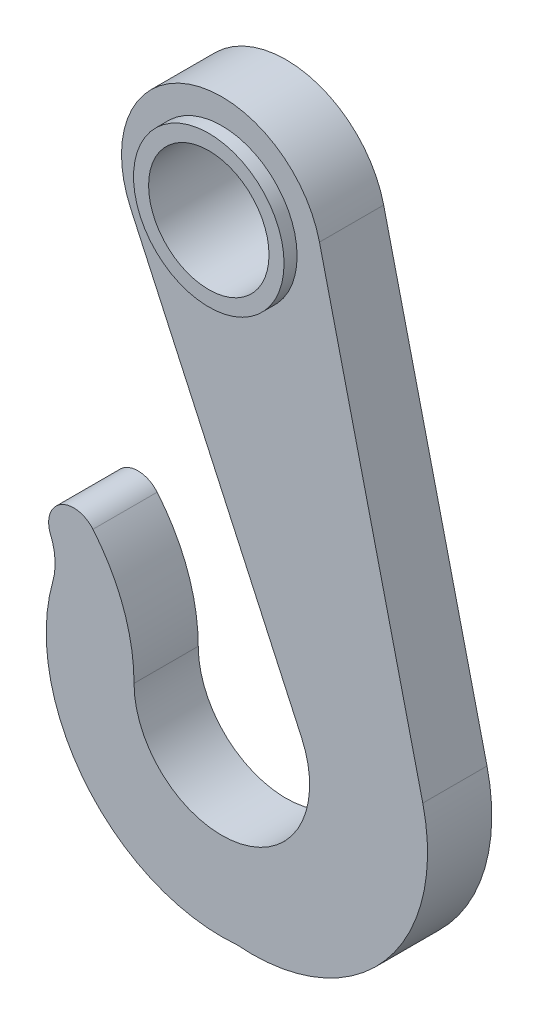
ISO-10303-21;
HEADER;
FILE_DESCRIPTION(('STEP AP214'),'2;1');
FILE_NAME('part.step','',(''),(''),'','','');
FILE_SCHEMA(('AUTOMOTIVE_DESIGN { 1 0 10303 214 1 1 1 1 }'));
ENDSEC;
DATA;
#1=APPLICATION_CONTEXT('core data for automotive mechanical design processes');
#2=APPLICATION_PROTOCOL_DEFINITION('international standard','automotive_design',2000,#1);
#3=PRODUCT_CONTEXT('',#1,'mechanical');
#4=PRODUCT('Part','Part','',(#3));
#5=PRODUCT_RELATED_PRODUCT_CATEGORY('part','',(#4));
#6=PRODUCT_DEFINITION_FORMATION('','',#4);
#7=PRODUCT_DEFINITION_CONTEXT('part definition',#1,'design');
#8=PRODUCT_DEFINITION('design','',#6,#7);
#9=PRODUCT_DEFINITION_SHAPE('','',#8);
#10=(LENGTH_UNIT() NAMED_UNIT(*) SI_UNIT(.MILLI.,.METRE.));
#11=(NAMED_UNIT(*) PLANE_ANGLE_UNIT() SI_UNIT($,.RADIAN.));
#12=(NAMED_UNIT(*) SI_UNIT($,.STERADIAN.) SOLID_ANGLE_UNIT());
#13=UNCERTAINTY_MEASURE_WITH_UNIT(LENGTH_MEASURE(1.E-05),#10,'distance_accuracy_value','');
#14=(GEOMETRIC_REPRESENTATION_CONTEXT(3) GLOBAL_UNCERTAINTY_ASSIGNED_CONTEXT((#13)) GLOBAL_UNIT_ASSIGNED_CONTEXT((#10,
#11,#12)) REPRESENTATION_CONTEXT('',''));
#15=CARTESIAN_POINT('',(0.,0.,0.));
#16=DIRECTION('',(0.,0.,1.));
#17=DIRECTION('',(1.,0.,0.));
#18=AXIS2_PLACEMENT_3D('',#15,#16,#17);
#19=CARTESIAN_POINT('',(0.,0.,0.64));
#20=DIRECTION('',(0.,0.,-1.));
#21=DIRECTION('',(-1.,0.,0.));
#22=AXIS2_PLACEMENT_3D('',#19,#20,#21);
#23=CYLINDRICAL_SURFACE('',#22,1.);
#24=CARTESIAN_POINT('',(0.,0.,0.));
#25=DIRECTION('',(0.,0.,1.));
#26=DIRECTION('',(1.,0.,0.));
#27=AXIS2_PLACEMENT_3D('',#24,#25,#26);
#28=CIRCLE('',#27,1.);
#29=CARTESIAN_POINT('',(0.972829673476124,0.231521978231741,0.));
#30=VERTEX_POINT('',#29);
#31=CARTESIAN_POINT('',(-0.909059342886309,-0.416666666666667,0.));
#32=VERTEX_POINT('',#31);
#33=EDGE_CURVE('E155',#30,#32,#28,.T.);
#34=ORIENTED_EDGE('',*,*,#33,.T.);
#35=DIRECTION('',(0.,0.,-1.));
#36=VECTOR('',#35,1.);
#37=CARTESIAN_POINT('',(-0.909059342886309,-0.416666666666667,0.64));
#38=LINE('',#37,#36);
#39=CARTESIAN_POINT('',(-0.909059342886309,-0.416666666666667,0.64));
#40=VERTEX_POINT('',#39);
#41=EDGE_CURVE('E48',#40,#32,#38,.T.);
#42=ORIENTED_EDGE('',*,*,#41,.F.);
#43=CARTESIAN_POINT('',(0.,0.,0.64));
#44=DIRECTION('',(0.,0.,1.));
#45=DIRECTION('',(1.,0.,0.));
#46=AXIS2_PLACEMENT_3D('',#43,#44,#45);
#47=CIRCLE('',#46,1.);
#48=CARTESIAN_POINT('',(0.972829673476124,0.231521978231741,0.64));
#49=VERTEX_POINT('',#48);
#50=EDGE_CURVE('E187',#49,#40,#47,.T.);
#51=ORIENTED_EDGE('',*,*,#50,.F.);
#52=DIRECTION('',(0.,0.,-1.));
#53=VECTOR('',#52,1.);
#54=CARTESIAN_POINT('',(0.972829673476124,0.231521978231741,0.64));
#55=LINE('',#54,#53);
#56=EDGE_CURVE('E64',#49,#30,#55,.T.);
#57=ORIENTED_EDGE('',*,*,#56,.T.);
#58=EDGE_LOOP('',(#34,#42,#51,#57));
#59=FACE_BOUND('',#58,.T.);
#60=ADVANCED_FACE('F45',(#59),#23,.T.);
#61=CARTESIAN_POINT('',(-0.909059342886309,-0.416666666666667,0.64));
#62=DIRECTION('',(0.90905934288631,0.416666666666667,0.));
#63=DIRECTION('',(-0.416666666666667,0.90905934288631,0.));
#64=AXIS2_PLACEMENT_3D('',#61,#62,#63);
#65=PLANE('',#64);
#66=DIRECTION('',(0.416666666666667,-0.90905934288631,0.));
#67=VECTOR('',#66,1.);
#68=CARTESIAN_POINT('',(-0.909059342886309,-0.416666666666667,0.));
#69=LINE('',#68,#67);
#70=CARTESIAN_POINT('',(0.795426925025521,-4.13541666666667,0.));
#71=VERTEX_POINT('',#70);
#72=EDGE_CURVE('E158',#32,#71,#69,.T.);
#73=ORIENTED_EDGE('',*,*,#72,.T.);
#74=DIRECTION('',(0.,0.,-1.));
#75=VECTOR('',#74,1.);
#76=CARTESIAN_POINT('',(0.795426925025521,-4.13541666666667,0.64));
#77=LINE('',#76,#75);
#78=CARTESIAN_POINT('',(0.795426925025521,-4.13541666666667,0.64));
#79=VERTEX_POINT('',#78);
#80=EDGE_CURVE('E203',#79,#71,#77,.T.);
#81=ORIENTED_EDGE('',*,*,#80,.F.);
#82=DIRECTION('',(0.416666666666667,-0.90905934288631,0.));
#83=VECTOR('',#82,1.);
#84=CARTESIAN_POINT('',(-0.909059342886309,-0.416666666666667,0.64));
#85=LINE('',#84,#83);
#86=EDGE_CURVE('E107',#40,#79,#85,.T.);
#87=ORIENTED_EDGE('',*,*,#86,.F.);
#88=ORIENTED_EDGE('',*,*,#41,.T.);
#89=EDGE_LOOP('',(#73,#81,#87,#88));
#90=FACE_BOUND('',#89,.T.);
#91=ADVANCED_FACE('F250',(#90),#65,.F.);
#92=CARTESIAN_POINT('',(0.,-4.5,0.64));
#93=DIRECTION('',(0.,0.,-1.));
#94=DIRECTION('',(-1.,0.,0.));
#95=AXIS2_PLACEMENT_3D('',#92,#93,#94);
#96=CYLINDRICAL_SURFACE('',#95,0.875);
#97=CARTESIAN_POINT('',(0.,-4.5,0.));
#98=DIRECTION('',(0.,0.,1.));
#99=DIRECTION('',(1.,0.,0.));
#100=AXIS2_PLACEMENT_3D('',#97,#98,#99);
#101=CIRCLE('',#100,0.875);
#102=CARTESIAN_POINT('',(-0.874999999999999,-4.5,0.));
#103=VERTEX_POINT('',#102);
#104=EDGE_CURVE('E163',#103,#71,#101,.T.);
#105=ORIENTED_EDGE('',*,*,#104,.F.);
#106=DIRECTION('',(0.,0.,-1.));
#107=VECTOR('',#106,1.);
#108=CARTESIAN_POINT('',(-0.874999999999999,-4.5,0.64));
#109=LINE('',#108,#107);
#110=CARTESIAN_POINT('',(-0.874999999999999,-4.5,0.64));
#111=VERTEX_POINT('',#110);
#112=EDGE_CURVE('E201',#111,#103,#109,.T.);
#113=ORIENTED_EDGE('',*,*,#112,.F.);
#114=CARTESIAN_POINT('',(0.,-4.5,0.64));
#115=DIRECTION('',(0.,0.,1.));
#116=DIRECTION('',(1.,0.,0.));
#117=AXIS2_PLACEMENT_3D('',#114,#115,#116);
#118=CIRCLE('',#117,0.875);
#119=EDGE_CURVE('E222',#111,#79,#118,.T.);
#120=ORIENTED_EDGE('',*,*,#119,.T.);
#121=ORIENTED_EDGE('',*,*,#80,.T.);
#122=EDGE_LOOP('',(#105,#113,#120,#121));
#123=FACE_BOUND('',#122,.T.);
#124=ADVANCED_FACE('F254',(#123),#96,.F.);
#125=CARTESIAN_POINT('',(-2.625,-4.5,0.64));
#126=DIRECTION('',(0.,0.,-1.));
#127=DIRECTION('',(-1.,0.,0.));
#128=AXIS2_PLACEMENT_3D('',#125,#126,#127);
#129=CYLINDRICAL_SURFACE('',#128,1.75);
#130=CARTESIAN_POINT('',(-2.625,-4.5,0.));
#131=DIRECTION('',(0.,0.,1.));
#132=DIRECTION('',(1.,0.,0.));
#133=AXIS2_PLACEMENT_3D('',#130,#131,#132);
#134=CIRCLE('',#133,1.75);
#135=CARTESIAN_POINT('',(-1.28442222454179,-3.37512168304855,0.));
#136=VERTEX_POINT('',#135);
#137=EDGE_CURVE('E167',#103,#136,#134,.T.);
#138=ORIENTED_EDGE('',*,*,#137,.T.);
#139=DIRECTION('',(0.,0.,-1.));
#140=VECTOR('',#139,1.);
#141=CARTESIAN_POINT('',(-1.28442222454179,-3.37512168304855,0.64));
#142=LINE('',#141,#140);
#143=CARTESIAN_POINT('',(-1.28442222454179,-3.37512168304855,0.64));
#144=VERTEX_POINT('',#143);
#145=EDGE_CURVE('E197',#144,#136,#142,.T.);
#146=ORIENTED_EDGE('',*,*,#145,.F.);
#147=CARTESIAN_POINT('',(-2.625,-4.5,0.64));
#148=DIRECTION('',(0.,0.,1.));
#149=DIRECTION('',(1.,0.,0.));
#150=AXIS2_PLACEMENT_3D('',#147,#148,#149);
#151=CIRCLE('',#150,1.75);
#152=EDGE_CURVE('E225',#111,#144,#151,.T.);
#153=ORIENTED_EDGE('',*,*,#152,.F.);
#154=ORIENTED_EDGE('',*,*,#112,.T.);
#155=EDGE_LOOP('',(#138,#146,#153,#154));
#156=FACE_BOUND('',#155,.T.);
#157=ADVANCED_FACE('F260',(#156),#129,.T.);
#158=CARTESIAN_POINT('',(-1.47593333532153,-3.53581858547019,0.64));
#159=DIRECTION('',(0.,0.,-1.));
#160=DIRECTION('',(-1.,0.,0.));
#161=AXIS2_PLACEMENT_3D('',#158,#159,#160);
#162=CYLINDRICAL_SURFACE('',#161,0.25);
#163=CARTESIAN_POINT('',(-1.47593333532153,-3.53581858547019,0.));
#164=DIRECTION('',(0.,0.,1.));
#165=DIRECTION('',(1.,0.,0.));
#166=AXIS2_PLACEMENT_3D('',#163,#164,#165);
#167=CIRCLE('',#166,0.25);
#168=CARTESIAN_POINT('',(-1.70694730682401,-3.63138293536413,0.));
#169=VERTEX_POINT('',#168);
#170=EDGE_CURVE('E170',#136,#169,#167,.T.);
#171=ORIENTED_EDGE('',*,*,#170,.T.);
#172=DIRECTION('',(0.,0.,-1.));
#173=VECTOR('',#172,1.);
#174=CARTESIAN_POINT('',(-1.70694730682401,-3.63138293536413,0.64));
#175=LINE('',#174,#173);
#176=CARTESIAN_POINT('',(-1.70694730682401,-3.63138293536413,0.64));
#177=VERTEX_POINT('',#176);
#178=EDGE_CURVE('E194',#177,#169,#175,.T.);
#179=ORIENTED_EDGE('',*,*,#178,.F.);
#180=CARTESIAN_POINT('',(-1.47593333532153,-3.53581858547019,0.64));
#181=DIRECTION('',(0.,0.,1.));
#182=DIRECTION('',(1.,0.,0.));
#183=AXIS2_PLACEMENT_3D('',#180,#181,#182);
#184=CIRCLE('',#183,0.25);
#185=EDGE_CURVE('E228',#144,#177,#184,.T.);
#186=ORIENTED_EDGE('',*,*,#185,.F.);
#187=ORIENTED_EDGE('',*,*,#145,.T.);
#188=EDGE_LOOP('',(#171,#179,#186,#187));
#189=FACE_BOUND('',#188,.T.);
#190=ADVANCED_FACE('F263',(#189),#162,.T.);
#191=CARTESIAN_POINT('',(-2.26138083842997,-3.86073737510958,0.64));
#192=DIRECTION('',(0.,0.,-1.));
#193=DIRECTION('',(-1.,0.,0.));
#194=AXIS2_PLACEMENT_3D('',#191,#192,#193);
#195=CYLINDRICAL_SURFACE('',#194,0.6);
#196=CARTESIAN_POINT('',(-2.26138083842997,-3.86073737510958,0.));
#197=DIRECTION('',(0.,0.,1.));
#198=DIRECTION('',(1.,0.,0.));
#199=AXIS2_PLACEMENT_3D('',#196,#197,#198);
#200=CIRCLE('',#199,0.6);
#201=CARTESIAN_POINT('',(-1.68400700734146,-4.02395336444331,0.));
#202=VERTEX_POINT('',#201);
#203=EDGE_CURVE('E174',#202,#169,#200,.T.);
#204=ORIENTED_EDGE('',*,*,#203,.F.);
#205=DIRECTION('',(0.,0.,-1.));
#206=VECTOR('',#205,1.);
#207=CARTESIAN_POINT('',(-1.68400700734146,-4.02395336444331,0.64));
#208=LINE('',#207,#206);
#209=CARTESIAN_POINT('',(-1.68400700734146,-4.02395336444331,0.64));
#210=VERTEX_POINT('',#209);
#211=EDGE_CURVE('E145',#210,#202,#208,.T.);
#212=ORIENTED_EDGE('',*,*,#211,.F.);
#213=CARTESIAN_POINT('',(-2.26138083842997,-3.86073737510958,0.64));
#214=DIRECTION('',(0.,0.,1.));
#215=DIRECTION('',(1.,0.,0.));
#216=AXIS2_PLACEMENT_3D('',#213,#214,#215);
#217=CIRCLE('',#216,0.6);
#218=EDGE_CURVE('E133',#210,#177,#217,.T.);
#219=ORIENTED_EDGE('',*,*,#218,.T.);
#220=ORIENTED_EDGE('',*,*,#178,.T.);
#221=EDGE_LOOP('',(#204,#212,#219,#220));
#222=FACE_BOUND('',#221,.T.);
#223=ADVANCED_FACE('F233',(#222),#195,.F.);
#224=CARTESIAN_POINT('',(0.,-4.5,0.64));
#225=DIRECTION('',(0.,0.,-1.));
#226=DIRECTION('',(-1.,0.,0.));
#227=AXIS2_PLACEMENT_3D('',#224,#225,#226);
#228=CYLINDRICAL_SURFACE('',#227,1.75);
#229=CARTESIAN_POINT('',(0.,-4.5,0.));
#230=DIRECTION('',(0.,0.,1.));
#231=DIRECTION('',(1.,0.,0.));
#232=AXIS2_PLACEMENT_3D('',#229,#230,#231);
#233=CIRCLE('',#232,1.75);
#234=CARTESIAN_POINT('',(0.150000000000004,-6.24355957741627,0.));
#235=VERTEX_POINT('',#234);
#236=EDGE_CURVE('E141',#202,#235,#233,.T.);
#237=ORIENTED_EDGE('',*,*,#236,.T.);
#238=DIRECTION('',(0.,0.,-1.));
#239=VECTOR('',#238,1.);
#240=CARTESIAN_POINT('',(0.150000000000004,-6.24355957741627,0.64));
#241=LINE('',#240,#239);
#242=CARTESIAN_POINT('',(0.150000000000004,-6.24355957741627,0.64));
#243=VERTEX_POINT('',#242);
#244=EDGE_CURVE('E138',#243,#235,#241,.T.);
#245=ORIENTED_EDGE('',*,*,#244,.F.);
#246=CARTESIAN_POINT('',(0.,-4.5,0.64));
#247=DIRECTION('',(0.,0.,1.));
#248=DIRECTION('',(1.,0.,0.));
#249=AXIS2_PLACEMENT_3D('',#246,#247,#248);
#250=CIRCLE('',#249,1.75);
#251=EDGE_CURVE('E126',#210,#243,#250,.T.);
#252=ORIENTED_EDGE('',*,*,#251,.F.);
#253=ORIENTED_EDGE('',*,*,#211,.T.);
#254=EDGE_LOOP('',(#237,#245,#252,#253));
#255=FACE_BOUND('',#254,.T.);
#256=ADVANCED_FACE('F139',(#255),#228,.T.);
#257=CARTESIAN_POINT('',(0.3,-4.5,0.64));
#258=DIRECTION('',(0.,0.,-1.));
#259=DIRECTION('',(-1.,0.,0.));
#260=AXIS2_PLACEMENT_3D('',#257,#258,#259);
#261=CYLINDRICAL_SURFACE('',#260,1.75);
#262=CARTESIAN_POINT('',(0.3,-4.5,0.));
#263=DIRECTION('',(0.,0.,1.));
#264=DIRECTION('',(1.,0.,0.));
#265=AXIS2_PLACEMENT_3D('',#262,#263,#264);
#266=CIRCLE('',#265,1.75);
#267=CARTESIAN_POINT('',(2.00245192858322,-4.09483653809445,0.));
#268=VERTEX_POINT('',#267);
#269=EDGE_CURVE('E180',#235,#268,#266,.T.);
#270=ORIENTED_EDGE('',*,*,#269,.T.);
#271=DIRECTION('',(0.,0.,-1.));
#272=VECTOR('',#271,1.);
#273=CARTESIAN_POINT('',(2.00245192858322,-4.09483653809445,0.64));
#274=LINE('',#273,#272);
#275=CARTESIAN_POINT('',(2.00245192858322,-4.09483653809445,0.64));
#276=VERTEX_POINT('',#275);
#277=EDGE_CURVE('E94',#276,#268,#274,.T.);
#278=ORIENTED_EDGE('',*,*,#277,.F.);
#279=CARTESIAN_POINT('',(0.3,-4.5,0.64));
#280=DIRECTION('',(0.,0.,1.));
#281=DIRECTION('',(1.,0.,0.));
#282=AXIS2_PLACEMENT_3D('',#279,#280,#281);
#283=CIRCLE('',#282,1.75);
#284=EDGE_CURVE('E131',#243,#276,#283,.T.);
#285=ORIENTED_EDGE('',*,*,#284,.F.);
#286=ORIENTED_EDGE('',*,*,#244,.T.);
#287=EDGE_LOOP('',(#270,#278,#285,#286));
#288=FACE_BOUND('',#287,.T.);
#289=ADVANCED_FACE('F147',(#288),#261,.T.);
#290=CARTESIAN_POINT('',(0.972829673476124,0.231521978231741,0.64));
#291=DIRECTION('',(0.972829673476123,0.231521978231742,0.));
#292=DIRECTION('',(-0.231521978231742,0.972829673476123,0.));
#293=AXIS2_PLACEMENT_3D('',#290,#291,#292);
#294=PLANE('',#293);
#295=DIRECTION('',(0.231521978231742,-0.972829673476123,0.));
#296=VECTOR('',#295,1.);
#297=CARTESIAN_POINT('',(0.972829673476124,0.231521978231741,0.));
#298=LINE('',#297,#296);
#299=EDGE_CURVE('E183',#30,#268,#298,.T.);
#300=ORIENTED_EDGE('',*,*,#299,.F.);
#301=ORIENTED_EDGE('',*,*,#56,.F.);
#302=DIRECTION('',(0.231521978231742,-0.972829673476123,0.));
#303=VECTOR('',#302,1.);
#304=CARTESIAN_POINT('',(0.972829673476124,0.231521978231741,0.64));
#305=LINE('',#304,#303);
#306=EDGE_CURVE('E149',#49,#276,#305,.T.);
#307=ORIENTED_EDGE('',*,*,#306,.T.);
#308=ORIENTED_EDGE('',*,*,#277,.T.);
#309=EDGE_LOOP('',(#300,#301,#307,#308));
#310=FACE_BOUND('',#309,.T.);
#311=ADVANCED_FACE('F238',(#310),#294,.T.);
#312=CARTESIAN_POINT('',(0.,0.,0.64));
#313=DIRECTION('',(0.,0.,1.));
#314=DIRECTION('',(1.,0.,0.));
#315=AXIS2_PLACEMENT_3D('',#312,#313,#314);
#316=PLANE('',#315);
#317=CARTESIAN_POINT('',(0.,0.,0.64));
#318=DIRECTION('',(0.,0.,1.));
#319=DIRECTION('',(1.,0.,0.));
#320=AXIS2_PLACEMENT_3D('',#317,#318,#319);
#321=CIRCLE('',#320,0.75);
#322=CARTESIAN_POINT('',(0.75,0.,0.64));
#323=VERTEX_POINT('',#322);
#324=EDGE_CURVE('E55',#323,#323,#321,.T.);
#325=ORIENTED_EDGE('',*,*,#324,.F.);
#326=EDGE_LOOP('',(#325));
#327=FACE_BOUND('',#326,.T.);
#328=ORIENTED_EDGE('',*,*,#50,.T.);
#329=ORIENTED_EDGE('',*,*,#86,.T.);
#330=ORIENTED_EDGE('',*,*,#119,.F.);
#331=ORIENTED_EDGE('',*,*,#152,.T.);
#332=ORIENTED_EDGE('',*,*,#185,.T.);
#333=ORIENTED_EDGE('',*,*,#218,.F.);
#334=ORIENTED_EDGE('',*,*,#251,.T.);
#335=ORIENTED_EDGE('',*,*,#284,.T.);
#336=ORIENTED_EDGE('',*,*,#306,.F.);
#337=EDGE_LOOP('',(#328,#329,#330,#331,#332,#333,#334,#335,#336));
#338=FACE_BOUND('',#337,.T.);
#339=ADVANCED_FACE('F128',(#327,#338),#316,.T.);
#340=CARTESIAN_POINT('',(0.,0.,0.));
#341=DIRECTION('',(0.,0.,1.));
#342=DIRECTION('',(1.,0.,0.));
#343=AXIS2_PLACEMENT_3D('',#340,#341,#342);
#344=PLANE('',#343);
#345=CARTESIAN_POINT('',(0.,0.,0.));
#346=DIRECTION('',(0.,0.,-1.));
#347=DIRECTION('',(-1.,0.,0.));
#348=AXIS2_PLACEMENT_3D('',#345,#346,#347);
#349=CIRCLE('',#348,0.75);
#350=CARTESIAN_POINT('',(-0.75,0.,0.));
#351=VERTEX_POINT('',#350);
#352=EDGE_CURVE('E11',#351,#351,#349,.T.);
#353=ORIENTED_EDGE('',*,*,#352,.F.);
#354=EDGE_LOOP('',(#353));
#355=FACE_BOUND('',#354,.T.);
#356=ORIENTED_EDGE('',*,*,#33,.F.);
#357=ORIENTED_EDGE('',*,*,#299,.T.);
#358=ORIENTED_EDGE('',*,*,#269,.F.);
#359=ORIENTED_EDGE('',*,*,#236,.F.);
#360=ORIENTED_EDGE('',*,*,#203,.T.);
#361=ORIENTED_EDGE('',*,*,#170,.F.);
#362=ORIENTED_EDGE('',*,*,#137,.F.);
#363=ORIENTED_EDGE('',*,*,#104,.T.);
#364=ORIENTED_EDGE('',*,*,#72,.F.);
#365=EDGE_LOOP('',(#356,#357,#358,#359,#360,#361,#362,#363,#364));
#366=FACE_BOUND('',#365,.T.);
#367=ADVANCED_FACE('F236',(#355,#366),#344,.F.);
#368=CARTESIAN_POINT('',(0.,0.,0.77));
#369=DIRECTION('',(0.,0.,1.));
#370=DIRECTION('',(1.,0.,0.));
#371=AXIS2_PLACEMENT_3D('',#368,#369,#370);
#372=PLANE('',#371);
#373=CARTESIAN_POINT('',(0.,0.,0.77));
#374=DIRECTION('',(0.,0.,1.));
#375=DIRECTION('',(1.,0.,0.));
#376=AXIS2_PLACEMENT_3D('',#373,#374,#375);
#377=CIRCLE('',#376,0.75);
#378=CARTESIAN_POINT('',(0.75,0.,0.77));
#379=VERTEX_POINT('',#378);
#380=EDGE_CURVE('E159',#379,#379,#377,.T.);
#381=ORIENTED_EDGE('',*,*,#380,.T.);
#382=EDGE_LOOP('',(#381));
#383=FACE_BOUND('',#382,.T.);
#384=CARTESIAN_POINT('',(0.,0.,0.77));
#385=DIRECTION('',(0.,0.,1.));
#386=DIRECTION('',(1.,0.,0.));
#387=AXIS2_PLACEMENT_3D('',#384,#385,#386);
#388=CIRCLE('',#387,0.6);
#389=CARTESIAN_POINT('',(0.6,0.,0.77));
#390=VERTEX_POINT('',#389);
#391=EDGE_CURVE('E391',#390,#390,#388,.T.);
#392=ORIENTED_EDGE('',*,*,#391,.F.);
#393=EDGE_LOOP('',(#392));
#394=FACE_BOUND('',#393,.T.);
#395=ADVANCED_FACE('F328',(#383,#394),#372,.T.);
#396=CARTESIAN_POINT('',(0.,0.,0.77));
#397=DIRECTION('',(0.,0.,-1.));
#398=DIRECTION('',(-1.,0.,0.));
#399=AXIS2_PLACEMENT_3D('',#396,#397,#398);
#400=CYLINDRICAL_SURFACE('',#399,0.75);
#401=ORIENTED_EDGE('',*,*,#380,.F.);
#402=EDGE_LOOP('',(#401));
#403=FACE_BOUND('',#402,.T.);
#404=ORIENTED_EDGE('',*,*,#324,.T.);
#405=EDGE_LOOP('',(#404));
#406=FACE_BOUND('',#405,.T.);
#407=ADVANCED_FACE('F338',(#403,#406),#400,.T.);
#408=CARTESIAN_POINT('',(0.,0.,0.77));
#409=DIRECTION('',(0.,0.,-1.));
#410=DIRECTION('',(-1.,0.,0.));
#411=AXIS2_PLACEMENT_3D('',#408,#409,#410);
#412=CYLINDRICAL_SURFACE('',#411,0.6);
#413=ORIENTED_EDGE('',*,*,#391,.T.);
#414=EDGE_LOOP('',(#413));
#415=FACE_BOUND('',#414,.T.);
#416=CARTESIAN_POINT('',(0.,0.,-0.13));
#417=DIRECTION('',(0.,0.,-1.));
#418=DIRECTION('',(-1.,0.,0.));
#419=AXIS2_PLACEMENT_3D('',#416,#417,#418);
#420=CIRCLE('',#419,0.6);
#421=CARTESIAN_POINT('',(-0.6,0.,-0.13));
#422=VERTEX_POINT('',#421);
#423=EDGE_CURVE('E392',#422,#422,#420,.T.);
#424=ORIENTED_EDGE('',*,*,#423,.T.);
#425=EDGE_LOOP('',(#424));
#426=FACE_BOUND('',#425,.T.);
#427=ADVANCED_FACE('F347',(#415,#426),#412,.F.);
#428=CARTESIAN_POINT('',(0.,0.,-0.13));
#429=DIRECTION('',(0.,0.,-1.));
#430=DIRECTION('',(-1.,0.,0.));
#431=AXIS2_PLACEMENT_3D('',#428,#429,#430);
#432=PLANE('',#431);
#433=CARTESIAN_POINT('',(0.,0.,-0.13));
#434=DIRECTION('',(0.,0.,-1.));
#435=DIRECTION('',(-1.,0.,0.));
#436=AXIS2_PLACEMENT_3D('',#433,#434,#435);
#437=CIRCLE('',#436,0.75);
#438=CARTESIAN_POINT('',(-0.75,0.,-0.13));
#439=VERTEX_POINT('',#438);
#440=EDGE_CURVE('E388',#439,#439,#437,.T.);
#441=ORIENTED_EDGE('',*,*,#440,.T.);
#442=EDGE_LOOP('',(#441));
#443=FACE_BOUND('',#442,.T.);
#444=ORIENTED_EDGE('',*,*,#423,.F.);
#445=EDGE_LOOP('',(#444));
#446=FACE_BOUND('',#445,.T.);
#447=ADVANCED_FACE('F358',(#443,#446),#432,.T.);
#448=CARTESIAN_POINT('',(0.,0.,-0.13));
#449=DIRECTION('',(0.,0.,1.));
#450=DIRECTION('',(1.,0.,0.));
#451=AXIS2_PLACEMENT_3D('',#448,#449,#450);
#452=CYLINDRICAL_SURFACE('',#451,0.75);
#453=ORIENTED_EDGE('',*,*,#440,.F.);
#454=EDGE_LOOP('',(#453));
#455=FACE_BOUND('',#454,.T.);
#456=ORIENTED_EDGE('',*,*,#352,.T.);
#457=EDGE_LOOP('',(#456));
#458=FACE_BOUND('',#457,.T.);
#459=ADVANCED_FACE('F369',(#455,#458),#452,.T.);
#460=CLOSED_SHELL('',(#60,#91,#124,#157,#190,#223,#256,#289,#311,#339,#367,#395,#407,#427,#447,#459));
#461=MANIFOLD_SOLID_BREP('B2',#460);
#462=ADVANCED_BREP_SHAPE_REPRESENTATION('',(#18,#461),#14);
#463=SHAPE_DEFINITION_REPRESENTATION(#9,#462);
ENDSEC;
END-ISO-10303-21;
